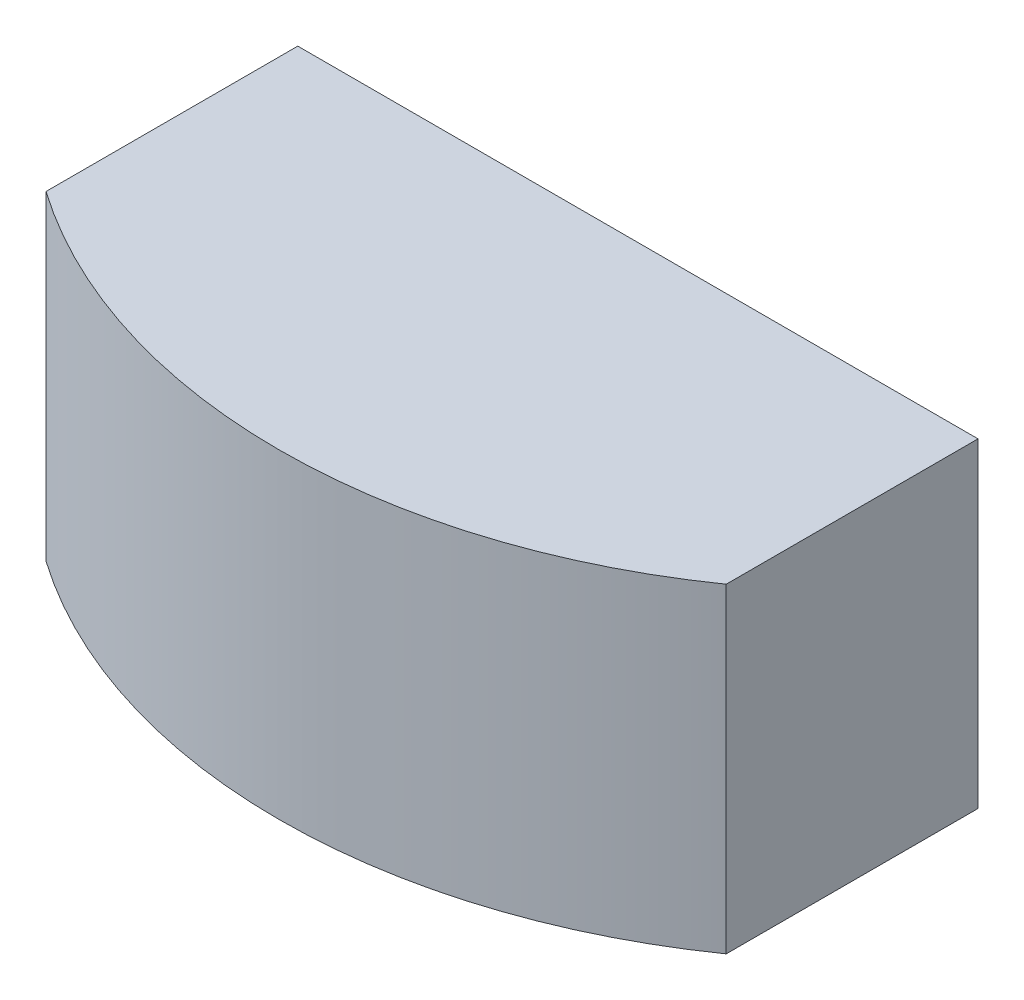
ISO-10303-21;
HEADER;
FILE_DESCRIPTION(('STEP AP214'),'2;1');
FILE_NAME('part.step','',(''),(''),'','','');
FILE_SCHEMA(('AUTOMOTIVE_DESIGN { 1 0 10303 214 1 1 1 1 }'));
ENDSEC;
DATA;
#1=APPLICATION_CONTEXT('core data for automotive mechanical design processes');
#2=APPLICATION_PROTOCOL_DEFINITION('international standard','automotive_design',2000,#1);
#3=PRODUCT_CONTEXT('',#1,'mechanical');
#4=PRODUCT('Part','Part','',(#3));
#5=PRODUCT_RELATED_PRODUCT_CATEGORY('part','',(#4));
#6=PRODUCT_DEFINITION_FORMATION('','',#4);
#7=PRODUCT_DEFINITION_CONTEXT('part definition',#1,'design');
#8=PRODUCT_DEFINITION('design','',#6,#7);
#9=PRODUCT_DEFINITION_SHAPE('','',#8);
#10=(LENGTH_UNIT() NAMED_UNIT(*) SI_UNIT(.MILLI.,.METRE.));
#11=(NAMED_UNIT(*) PLANE_ANGLE_UNIT() SI_UNIT($,.RADIAN.));
#12=(NAMED_UNIT(*) SI_UNIT($,.STERADIAN.) SOLID_ANGLE_UNIT());
#13=UNCERTAINTY_MEASURE_WITH_UNIT(LENGTH_MEASURE(1.E-05),#10,'distance_accuracy_value','');
#14=(GEOMETRIC_REPRESENTATION_CONTEXT(3) GLOBAL_UNCERTAINTY_ASSIGNED_CONTEXT((#13)) GLOBAL_UNIT_ASSIGNED_CONTEXT((#10,
#11,#12)) REPRESENTATION_CONTEXT('',''));
#15=CARTESIAN_POINT('',(0.,0.,0.));
#16=DIRECTION('',(0.,0.,1.));
#17=DIRECTION('',(1.,0.,0.));
#18=AXIS2_PLACEMENT_3D('',#15,#16,#17);
#19=CARTESIAN_POINT('',(-390.000000000001,-329.393398282201,411.664690552111));
#20=DIRECTION('',(0.,1.,0.));
#21=DIRECTION('',(-1.,0.,0.));
#22=AXIS2_PLACEMENT_3D('',#19,#20,#21);
#23=PLANE('',#22);
#24=CARTESIAN_POINT('',(-2.11997086552173E-12,-329.393398282203,-268.336309447892));
#25=DIRECTION('',(0.,1.,0.));
#26=DIRECTION('',(-1.,0.,0.));
#27=AXIS2_PLACEMENT_3D('',#24,#25,#26);
#28=CIRCLE('',#27,680.);
#29=CARTESIAN_POINT('',(-390.000000000001,-329.393398282201,288.709469640327));
#30=VERTEX_POINT('',#29);
#31=CARTESIAN_POINT('',(389.999999999999,-329.393398282204,288.709469640326));
#32=VERTEX_POINT('',#31);
#33=EDGE_CURVE('E159',#30,#32,#28,.T.);
#34=ORIENTED_EDGE('',*,*,#33,.F.);
#35=DIRECTION('',(0.,0.,-1.));
#36=VECTOR('',#35,1.);
#37=CARTESIAN_POINT('',(-390.000000000001,-329.393398282201,411.664690552111));
#38=LINE('',#37,#36);
#39=CARTESIAN_POINT('',(-390.000000000001,-329.393398282201,0.));
#40=VERTEX_POINT('',#39);
#41=EDGE_CURVE('E40',#30,#40,#38,.T.);
#42=ORIENTED_EDGE('',*,*,#41,.T.);
#43=DIRECTION('',(1.,0.,0.));
#44=VECTOR('',#43,1.);
#45=CARTESIAN_POINT('',(-390.000000000001,-329.393398282201,0.));
#46=LINE('',#45,#44);
#47=CARTESIAN_POINT('',(389.999999999999,-329.393398282204,0.));
#48=VERTEX_POINT('',#47);
#49=EDGE_CURVE('E155',#40,#48,#46,.T.);
#50=ORIENTED_EDGE('',*,*,#49,.T.);
#51=DIRECTION('',(0.,0.,-1.));
#52=VECTOR('',#51,1.);
#53=CARTESIAN_POINT('',(389.999999999999,-329.393398282204,411.664690552111));
#54=LINE('',#53,#52);
#55=EDGE_CURVE('E75',#32,#48,#54,.T.);
#56=ORIENTED_EDGE('',*,*,#55,.F.);
#57=EDGE_LOOP('',(#34,#42,#50,#56));
#58=FACE_BOUND('',#57,.T.);
#59=ADVANCED_FACE('F36',(#58),#23,.F.);
#60=CARTESIAN_POINT('',(389.999999999999,-329.393398282204,411.664690552111));
#61=DIRECTION('',(-1.,0.,0.));
#62=DIRECTION('',(0.,-1.,0.));
#63=AXIS2_PLACEMENT_3D('',#60,#61,#62);
#64=PLANE('',#63);
#65=DIRECTION('',(0.,1.,0.));
#66=VECTOR('',#65,1.);
#67=CARTESIAN_POINT('',(389.999999999999,-324.393398282204,288.709469640325));
#68=LINE('',#67,#66);
#69=CARTESIAN_POINT('',(390.000000000001,37.7297077300907,288.709469640327));
#70=VERTEX_POINT('',#69);
#71=EDGE_CURVE('E45',#32,#70,#68,.T.);
#72=ORIENTED_EDGE('',*,*,#71,.F.);
#73=ORIENTED_EDGE('',*,*,#55,.T.);
#74=DIRECTION('',(0.,1.,0.));
#75=VECTOR('',#74,1.);
#76=CARTESIAN_POINT('',(389.999999999999,-329.393398282204,0.));
#77=LINE('',#76,#75);
#78=CARTESIAN_POINT('',(390.000000000001,37.7297077300907,0.));
#79=VERTEX_POINT('',#78);
#80=EDGE_CURVE('E153',#48,#79,#77,.T.);
#81=ORIENTED_EDGE('',*,*,#80,.T.);
#82=DIRECTION('',(0.,0.,-1.));
#83=VECTOR('',#82,1.);
#84=CARTESIAN_POINT('',(390.000000000001,37.7297077300907,411.664690552111));
#85=LINE('',#84,#83);
#86=EDGE_CURVE('E152',#70,#79,#85,.T.);
#87=ORIENTED_EDGE('',*,*,#86,.F.);
#88=EDGE_LOOP('',(#72,#73,#81,#87));
#89=FACE_BOUND('',#88,.T.);
#90=ADVANCED_FACE('F169',(#89),#64,.F.);
#91=CARTESIAN_POINT('',(390.000000000001,37.7297077300907,411.664690552111));
#92=DIRECTION('',(0.,-1.,0.));
#93=DIRECTION('',(1.,0.,0.));
#94=AXIS2_PLACEMENT_3D('',#91,#92,#93);
#95=PLANE('',#94);
#96=CARTESIAN_POINT('',(-9.37964142538154E-13,37.7297077300919,-268.33630944789));
#97=DIRECTION('',(0.,-1.,0.));
#98=DIRECTION('',(1.,0.,0.));
#99=AXIS2_PLACEMENT_3D('',#96,#97,#98);
#100=CIRCLE('',#99,680.);
#101=CARTESIAN_POINT('',(-390.,37.7297077300931,288.709469640328));
#102=VERTEX_POINT('',#101);
#103=EDGE_CURVE('E12',#70,#102,#100,.T.);
#104=ORIENTED_EDGE('',*,*,#103,.F.);
#105=ORIENTED_EDGE('',*,*,#86,.T.);
#106=DIRECTION('',(-1.,0.,0.));
#107=VECTOR('',#106,1.);
#108=CARTESIAN_POINT('',(390.000000000001,37.7297077300907,0.));
#109=LINE('',#108,#107);
#110=CARTESIAN_POINT('',(-390.,37.7297077300931,0.));
#111=VERTEX_POINT('',#110);
#112=EDGE_CURVE('E150',#79,#111,#109,.T.);
#113=ORIENTED_EDGE('',*,*,#112,.T.);
#114=DIRECTION('',(0.,0.,-1.));
#115=VECTOR('',#114,1.);
#116=CARTESIAN_POINT('',(-390.,37.7297077300931,411.664690552111));
#117=LINE('',#116,#115);
#118=EDGE_CURVE('E58',#102,#111,#117,.T.);
#119=ORIENTED_EDGE('',*,*,#118,.F.);
#120=EDGE_LOOP('',(#104,#105,#113,#119));
#121=FACE_BOUND('',#120,.T.);
#122=ADVANCED_FACE('F166',(#121),#95,.F.);
#123=CARTESIAN_POINT('',(-390.,37.7297077300931,411.664690552111));
#124=DIRECTION('',(1.,0.,0.));
#125=DIRECTION('',(0.,1.,0.));
#126=AXIS2_PLACEMENT_3D('',#123,#124,#125);
#127=PLANE('',#126);
#128=DIRECTION('',(0.,1.,0.));
#129=VECTOR('',#128,1.);
#130=CARTESIAN_POINT('',(-390.000000000001,-324.393398282202,288.709469640327));
#131=LINE('',#130,#129);
#132=EDGE_CURVE('E149',#102,#30,#131,.F.);
#133=ORIENTED_EDGE('',*,*,#132,.F.);
#134=ORIENTED_EDGE('',*,*,#118,.T.);
#135=DIRECTION('',(0.,-1.,0.));
#136=VECTOR('',#135,1.);
#137=CARTESIAN_POINT('',(-390.,37.7297077300931,0.));
#138=LINE('',#137,#136);
#139=EDGE_CURVE('E147',#111,#40,#138,.T.);
#140=ORIENTED_EDGE('',*,*,#139,.T.);
#141=ORIENTED_EDGE('',*,*,#41,.F.);
#142=EDGE_LOOP('',(#133,#134,#140,#141));
#143=FACE_BOUND('',#142,.T.);
#144=ADVANCED_FACE('F173',(#143),#127,.F.);
#145=CARTESIAN_POINT('',(0.,0.,0.));
#146=DIRECTION('',(0.,0.,1.));
#147=DIRECTION('',(1.,0.,0.));
#148=AXIS2_PLACEMENT_3D('',#145,#146,#147);
#149=PLANE('',#148);
#150=ORIENTED_EDGE('',*,*,#49,.F.);
#151=ORIENTED_EDGE('',*,*,#139,.F.);
#152=ORIENTED_EDGE('',*,*,#112,.F.);
#153=ORIENTED_EDGE('',*,*,#80,.F.);
#154=EDGE_LOOP('',(#150,#151,#152,#153));
#155=FACE_BOUND('',#154,.T.);
#156=ADVANCED_FACE('F172',(#155),#149,.F.);
#157=CARTESIAN_POINT('',(-2.10387263166466E-12,-324.393398282201,-268.336309447892));
#158=DIRECTION('',(0.,1.,0.));
#159=DIRECTION('',(-0.656059028990481,0.,0.754709580222795));
#160=AXIS2_PLACEMENT_3D('',#157,#158,#159);
#161=CYLINDRICAL_SURFACE('',#160,680.);
#162=ORIENTED_EDGE('',*,*,#132,.T.);
#163=ORIENTED_EDGE('',*,*,#33,.T.);
#164=ORIENTED_EDGE('',*,*,#71,.T.);
#165=ORIENTED_EDGE('',*,*,#103,.T.);
#166=EDGE_LOOP('',(#162,#163,#164,#165));
#167=FACE_BOUND('',#166,.T.);
#168=ADVANCED_FACE('F38',(#167),#161,.T.);
#169=CLOSED_SHELL('',(#59,#90,#122,#144,#156,#168));
#170=CARTESIAN_POINT('',(-2.10387263166466E-12,-324.393398282201,-268.336309447892));
#171=DIRECTION('',(0.,1.,0.));
#172=DIRECTION('',(-0.656059028990481,0.,0.754709580222795));
#173=AXIS2_PLACEMENT_3D('',#170,#171,#172);
#174=CYLINDRICAL_SURFACE('',#173,675.);
#175=DIRECTION('',(0.,1.,0.));
#176=VECTOR('',#175,1.);
#177=CARTESIAN_POINT('',(-385.,-324.393398282203,286.100341577274));
#178=LINE('',#177,#176);
#179=CARTESIAN_POINT('',(-385.,-324.393398282199,286.100341577274));
#180=VERTEX_POINT('',#179);
#181=CARTESIAN_POINT('',(-385.,32.7297077300907,286.100341577275));
#182=VERTEX_POINT('',#181);
#183=EDGE_CURVE('E128',#180,#182,#178,.T.);
#184=ORIENTED_EDGE('',*,*,#183,.T.);
#185=CARTESIAN_POINT('',(-9.54062376395223E-13,32.7297077300907,-268.33630944789));
#186=DIRECTION('',(0.,1.,0.));
#187=DIRECTION('',(0.,0.,1.));
#188=AXIS2_PLACEMENT_3D('',#185,#186,#187);
#189=CIRCLE('',#188,675.);
#190=CARTESIAN_POINT('',(385.,32.7297077300907,286.100341577273));
#191=VERTEX_POINT('',#190);
#192=EDGE_CURVE('E122',#182,#191,#189,.T.);
#193=ORIENTED_EDGE('',*,*,#192,.T.);
#194=DIRECTION('',(0.,1.,0.));
#195=VECTOR('',#194,1.);
#196=CARTESIAN_POINT('',(385.,-324.393398282203,286.100341577271));
#197=LINE('',#196,#195);
#198=CARTESIAN_POINT('',(385.,-324.393398282199,286.100341577271));
#199=VERTEX_POINT('',#198);
#200=EDGE_CURVE('E108',#191,#199,#197,.F.);
#201=ORIENTED_EDGE('',*,*,#200,.T.);
#202=CARTESIAN_POINT('',(-2.10387263166465E-12,-324.393398282199,-268.336309447892));
#203=DIRECTION('',(0.,-1.,0.));
#204=DIRECTION('',(0.,0.,-1.));
#205=AXIS2_PLACEMENT_3D('',#202,#203,#204);
#206=CIRCLE('',#205,675.);
#207=EDGE_CURVE('E142',#199,#180,#206,.T.);
#208=ORIENTED_EDGE('',*,*,#207,.T.);
#209=EDGE_LOOP('',(#184,#193,#201,#208));
#210=FACE_BOUND('',#209,.T.);
#211=ADVANCED_FACE('F127',(#210),#174,.F.);
#212=CARTESIAN_POINT('',(0.,0.,5.));
#213=DIRECTION('',(0.,0.,-1.));
#214=DIRECTION('',(-1.,0.,0.));
#215=AXIS2_PLACEMENT_3D('',#212,#213,#214);
#216=PLANE('',#215);
#217=DIRECTION('',(0.,1.,0.));
#218=VECTOR('',#217,1.);
#219=CARTESIAN_POINT('',(-385.,32.7297077300907,5.));
#220=LINE('',#219,#218);
#221=CARTESIAN_POINT('',(-385.,-324.393398282199,5.));
#222=VERTEX_POINT('',#221);
#223=CARTESIAN_POINT('',(-385.,32.7297077300907,5.));
#224=VERTEX_POINT('',#223);
#225=EDGE_CURVE('E137',#222,#224,#220,.T.);
#226=ORIENTED_EDGE('',*,*,#225,.F.);
#227=DIRECTION('',(-1.,0.,0.));
#228=VECTOR('',#227,1.);
#229=CARTESIAN_POINT('',(385.,-324.393398282199,5.));
#230=LINE('',#229,#228);
#231=CARTESIAN_POINT('',(385.,-324.393398282199,5.));
#232=VERTEX_POINT('',#231);
#233=EDGE_CURVE('E130',#232,#222,#230,.T.);
#234=ORIENTED_EDGE('',*,*,#233,.F.);
#235=DIRECTION('',(0.,-1.,0.));
#236=VECTOR('',#235,1.);
#237=CARTESIAN_POINT('',(385.,32.7297077300907,5.));
#238=LINE('',#237,#236);
#239=CARTESIAN_POINT('',(385.,32.7297077300907,5.));
#240=VERTEX_POINT('',#239);
#241=EDGE_CURVE('E133',#240,#232,#238,.T.);
#242=ORIENTED_EDGE('',*,*,#241,.F.);
#243=DIRECTION('',(1.,0.,0.));
#244=VECTOR('',#243,1.);
#245=CARTESIAN_POINT('',(385.,32.7297077300907,5.));
#246=LINE('',#245,#244);
#247=EDGE_CURVE('E125',#224,#240,#246,.T.);
#248=ORIENTED_EDGE('',*,*,#247,.F.);
#249=EDGE_LOOP('',(#226,#234,#242,#248));
#250=FACE_BOUND('',#249,.T.);
#251=ADVANCED_FACE('F200',(#250),#216,.F.);
#252=CARTESIAN_POINT('',(385.,32.7297077300907,421.66469055211));
#253=DIRECTION('',(0.,1.,0.));
#254=DIRECTION('',(0.,0.,1.));
#255=AXIS2_PLACEMENT_3D('',#252,#253,#254);
#256=PLANE('',#255);
#257=DIRECTION('',(0.,0.,-1.));
#258=VECTOR('',#257,1.);
#259=CARTESIAN_POINT('',(-385.,32.7297077300907,421.66469055211));
#260=LINE('',#259,#258);
#261=EDGE_CURVE('E140',#182,#224,#260,.T.);
#262=ORIENTED_EDGE('',*,*,#261,.T.);
#263=ORIENTED_EDGE('',*,*,#247,.T.);
#264=DIRECTION('',(0.,0.,-1.));
#265=VECTOR('',#264,1.);
#266=CARTESIAN_POINT('',(385.,32.7297077300907,421.66469055211));
#267=LINE('',#266,#265);
#268=EDGE_CURVE('E112',#191,#240,#267,.T.);
#269=ORIENTED_EDGE('',*,*,#268,.F.);
#270=ORIENTED_EDGE('',*,*,#192,.F.);
#271=EDGE_LOOP('',(#262,#263,#269,#270));
#272=FACE_BOUND('',#271,.T.);
#273=ADVANCED_FACE('F121',(#272),#256,.F.);
#274=CARTESIAN_POINT('',(385.,32.7297077300907,421.66469055211));
#275=DIRECTION('',(1.,0.,0.));
#276=DIRECTION('',(0.,0.,-1.));
#277=AXIS2_PLACEMENT_3D('',#274,#275,#276);
#278=PLANE('',#277);
#279=ORIENTED_EDGE('',*,*,#268,.T.);
#280=ORIENTED_EDGE('',*,*,#241,.T.);
#281=DIRECTION('',(0.,0.,-1.));
#282=VECTOR('',#281,1.);
#283=CARTESIAN_POINT('',(385.,-324.393398282199,421.66469055211));
#284=LINE('',#283,#282);
#285=EDGE_CURVE('E114',#199,#232,#284,.T.);
#286=ORIENTED_EDGE('',*,*,#285,.F.);
#287=ORIENTED_EDGE('',*,*,#200,.F.);
#288=EDGE_LOOP('',(#279,#280,#286,#287));
#289=FACE_BOUND('',#288,.T.);
#290=ADVANCED_FACE('F110',(#289),#278,.F.);
#291=CARTESIAN_POINT('',(385.,-324.393398282199,421.66469055211));
#292=DIRECTION('',(0.,-1.,0.));
#293=DIRECTION('',(0.,0.,-1.));
#294=AXIS2_PLACEMENT_3D('',#291,#292,#293);
#295=PLANE('',#294);
#296=ORIENTED_EDGE('',*,*,#285,.T.);
#297=ORIENTED_EDGE('',*,*,#233,.T.);
#298=DIRECTION('',(0.,0.,-1.));
#299=VECTOR('',#298,1.);
#300=CARTESIAN_POINT('',(-385.,-324.393398282199,421.66469055211));
#301=LINE('',#300,#299);
#302=EDGE_CURVE('E141',#180,#222,#301,.T.);
#303=ORIENTED_EDGE('',*,*,#302,.F.);
#304=ORIENTED_EDGE('',*,*,#207,.F.);
#305=EDGE_LOOP('',(#296,#297,#303,#304));
#306=FACE_BOUND('',#305,.T.);
#307=ADVANCED_FACE('F221',(#306),#295,.F.);
#308=CARTESIAN_POINT('',(-385.,32.7297077300907,421.66469055211));
#309=DIRECTION('',(-1.,0.,0.));
#310=DIRECTION('',(0.,0.,1.));
#311=AXIS2_PLACEMENT_3D('',#308,#309,#310);
#312=PLANE('',#311);
#313=ORIENTED_EDGE('',*,*,#302,.T.);
#314=ORIENTED_EDGE('',*,*,#225,.T.);
#315=ORIENTED_EDGE('',*,*,#261,.F.);
#316=ORIENTED_EDGE('',*,*,#183,.F.);
#317=EDGE_LOOP('',(#313,#314,#315,#316));
#318=FACE_BOUND('',#317,.T.);
#319=ADVANCED_FACE('F228',(#318),#312,.F.);
#320=CLOSED_SHELL('',(#211,#251,#273,#290,#307,#319));
#321=ORIENTED_CLOSED_SHELL('',*,#320,.T.);
#322=BREP_WITH_VOIDS('B2',#169,(#321));
#323=ADVANCED_BREP_SHAPE_REPRESENTATION('',(#18,#322),#14);
#324=SHAPE_DEFINITION_REPRESENTATION(#9,#323);
ENDSEC;
END-ISO-10303-21;
